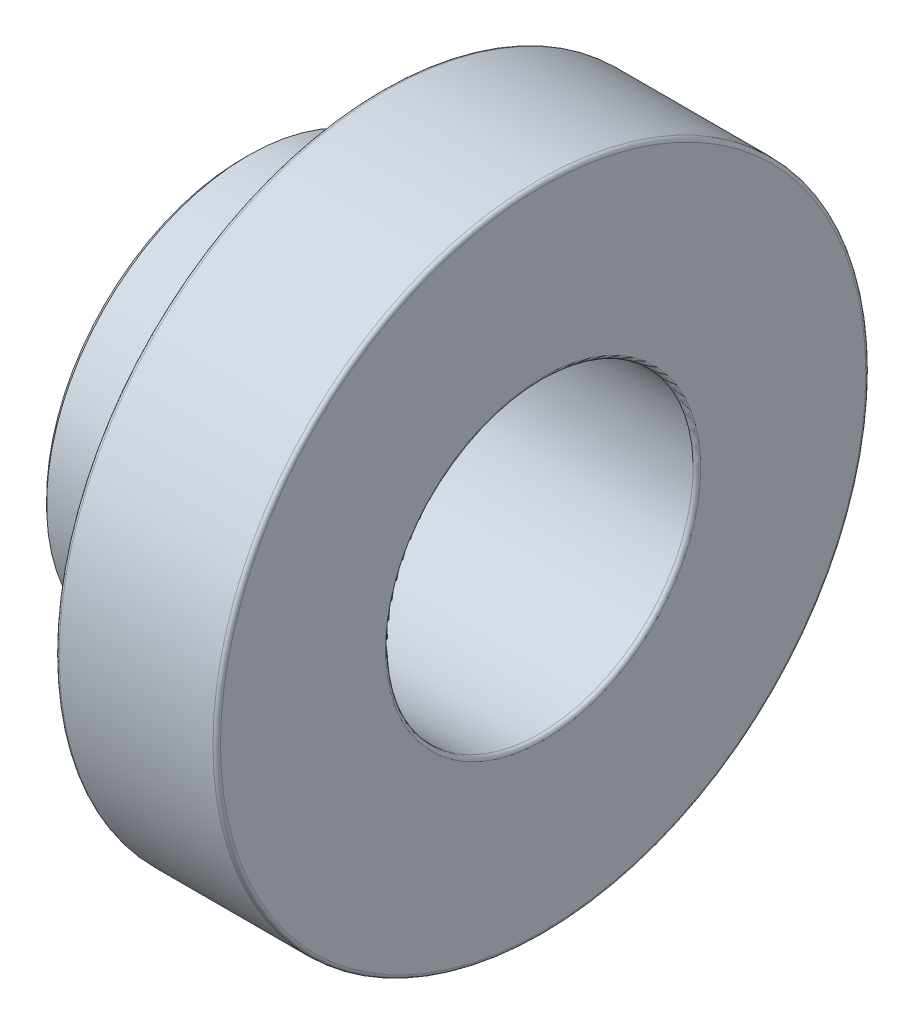
ISO-10303-21;
HEADER;
FILE_DESCRIPTION(('STEP AP214'),'2;1');
FILE_NAME('part.step','',(''),(''),'','','');
FILE_SCHEMA(('AUTOMOTIVE_DESIGN { 1 0 10303 214 1 1 1 1 }'));
ENDSEC;
DATA;
#1=APPLICATION_CONTEXT('core data for automotive mechanical design processes');
#2=APPLICATION_PROTOCOL_DEFINITION('international standard','automotive_design',2000,#1);
#3=PRODUCT_CONTEXT('',#1,'mechanical');
#4=PRODUCT('Part','Part','',(#3));
#5=PRODUCT_RELATED_PRODUCT_CATEGORY('part','',(#4));
#6=PRODUCT_DEFINITION_FORMATION('','',#4);
#7=PRODUCT_DEFINITION_CONTEXT('part definition',#1,'design');
#8=PRODUCT_DEFINITION('design','',#6,#7);
#9=PRODUCT_DEFINITION_SHAPE('','',#8);
#10=(LENGTH_UNIT() NAMED_UNIT(*) SI_UNIT(.MILLI.,.METRE.));
#11=(NAMED_UNIT(*) PLANE_ANGLE_UNIT() SI_UNIT($,.RADIAN.));
#12=(NAMED_UNIT(*) SI_UNIT($,.STERADIAN.) SOLID_ANGLE_UNIT());
#13=UNCERTAINTY_MEASURE_WITH_UNIT(LENGTH_MEASURE(1.E-05),#10,'distance_accuracy_value','');
#14=(GEOMETRIC_REPRESENTATION_CONTEXT(3) GLOBAL_UNCERTAINTY_ASSIGNED_CONTEXT((#13)) GLOBAL_UNIT_ASSIGNED_CONTEXT((#10,
#11,#12)) REPRESENTATION_CONTEXT('',''));
#15=CARTESIAN_POINT('',(0.,0.,0.));
#16=DIRECTION('',(0.,0.,1.));
#17=DIRECTION('',(1.,0.,0.));
#18=AXIS2_PLACEMENT_3D('',#15,#16,#17);
#19=CARTESIAN_POINT('',(6.4,6.1,0.));
#20=DIRECTION('',(1.,0.,0.));
#21=DIRECTION('',(0.,1.,0.));
#22=AXIS2_PLACEMENT_3D('',#19,#20,#21);
#23=PLANE('',#22);
#24=CARTESIAN_POINT('',(6.4,0.,0.));
#25=DIRECTION('',(1.,0.,0.));
#26=DIRECTION('',(0.,1.,0.));
#27=AXIS2_PLACEMENT_3D('',#24,#25,#26);
#28=CIRCLE('',#27,6.25);
#29=CARTESIAN_POINT('',(6.4,6.25,0.));
#30=VERTEX_POINT('',#29);
#31=EDGE_CURVE('E51',#30,#30,#28,.F.);
#32=ORIENTED_EDGE('',*,*,#31,.T.);
#33=EDGE_LOOP('',(#32));
#34=FACE_BOUND('',#33,.T.);
#35=CARTESIAN_POINT('',(6.4,0.,0.));
#36=DIRECTION('',(1.,0.,0.));
#37=DIRECTION('',(0.,1.,0.));
#38=AXIS2_PLACEMENT_3D('',#35,#36,#37);
#39=CIRCLE('',#38,12.8);
#40=CARTESIAN_POINT('',(6.4,12.8,0.));
#41=VERTEX_POINT('',#40);
#42=EDGE_CURVE('E66',#41,#41,#39,.T.);
#43=ORIENTED_EDGE('',*,*,#42,.T.);
#44=EDGE_LOOP('',(#43));
#45=FACE_BOUND('',#44,.T.);
#46=ADVANCED_FACE('F31',(#34,#45),#23,.T.);
#47=CARTESIAN_POINT('',(6.4,0.,0.));
#48=DIRECTION('',(1.,0.,0.));
#49=DIRECTION('',(0.,1.,0.));
#50=AXIS2_PLACEMENT_3D('',#47,#48,#49);
#51=CYLINDRICAL_SURFACE('',#50,12.95);
#52=CARTESIAN_POINT('',(6.25,0.,0.));
#53=DIRECTION('',(1.,0.,0.));
#54=DIRECTION('',(0.,1.,0.));
#55=AXIS2_PLACEMENT_3D('',#52,#53,#54);
#56=CIRCLE('',#55,12.95);
#57=CARTESIAN_POINT('',(6.25,12.95,0.));
#58=VERTEX_POINT('',#57);
#59=EDGE_CURVE('E60',#58,#58,#56,.F.);
#60=ORIENTED_EDGE('',*,*,#59,.T.);
#61=EDGE_LOOP('',(#60));
#62=FACE_BOUND('',#61,.T.);
#63=CARTESIAN_POINT('',(0.15,0.,0.));
#64=DIRECTION('',(-1.,0.,0.));
#65=DIRECTION('',(0.,-1.,0.));
#66=AXIS2_PLACEMENT_3D('',#63,#64,#65);
#67=CIRCLE('',#66,12.95);
#68=CARTESIAN_POINT('',(0.150000000000001,-12.95,0.));
#69=VERTEX_POINT('',#68);
#70=EDGE_CURVE('E63',#69,#69,#67,.F.);
#71=ORIENTED_EDGE('',*,*,#70,.T.);
#72=EDGE_LOOP('',(#71));
#73=FACE_BOUND('',#72,.T.);
#74=ADVANCED_FACE('F86',(#62,#73),#51,.T.);
#75=CARTESIAN_POINT('',(0.,12.95,0.));
#76=DIRECTION('',(-1.,0.,0.));
#77=DIRECTION('',(0.,-1.,0.));
#78=AXIS2_PLACEMENT_3D('',#75,#76,#77);
#79=PLANE('',#78);
#80=CARTESIAN_POINT('',(0.,0.,0.));
#81=DIRECTION('',(-1.,0.,0.));
#82=DIRECTION('',(0.,-1.,0.));
#83=AXIS2_PLACEMENT_3D('',#80,#81,#82);
#84=CIRCLE('',#83,12.8);
#85=CARTESIAN_POINT('',(0.,-12.8,0.));
#86=VERTEX_POINT('',#85);
#87=EDGE_CURVE('E57',#86,#86,#84,.T.);
#88=ORIENTED_EDGE('',*,*,#87,.T.);
#89=EDGE_LOOP('',(#88));
#90=FACE_BOUND('',#89,.T.);
#91=CARTESIAN_POINT('',(0.,0.,0.));
#92=DIRECTION('',(1.,0.,0.));
#93=DIRECTION('',(0.,1.,0.));
#94=AXIS2_PLACEMENT_3D('',#91,#92,#93);
#95=CIRCLE('',#94,8.);
#96=CARTESIAN_POINT('',(0.,8.,0.));
#97=VERTEX_POINT('',#96);
#98=EDGE_CURVE('E69',#97,#97,#95,.T.);
#99=ORIENTED_EDGE('',*,*,#98,.T.);
#100=EDGE_LOOP('',(#99));
#101=FACE_BOUND('',#100,.T.);
#102=ADVANCED_FACE('F73',(#90,#101),#79,.T.);
#103=CARTESIAN_POINT('',(6.4,0.,0.));
#104=DIRECTION('',(1.,0.,0.));
#105=DIRECTION('',(0.,1.,0.));
#106=AXIS2_PLACEMENT_3D('',#103,#104,#105);
#107=CYLINDRICAL_SURFACE('',#106,8.);
#108=CARTESIAN_POINT('',(-5.30000000000001,0.,0.));
#109=DIRECTION('',(-1.,0.,0.));
#110=DIRECTION('',(0.,-1.,0.));
#111=AXIS2_PLACEMENT_3D('',#108,#109,#110);
#112=CIRCLE('',#111,8.);
#113=CARTESIAN_POINT('',(-5.30000000000001,-8.,0.));
#114=VERTEX_POINT('',#113);
#115=EDGE_CURVE('E10',#114,#114,#112,.F.);
#116=ORIENTED_EDGE('',*,*,#115,.T.);
#117=EDGE_LOOP('',(#116));
#118=FACE_BOUND('',#117,.T.);
#119=ORIENTED_EDGE('',*,*,#98,.F.);
#120=EDGE_LOOP('',(#119));
#121=FACE_BOUND('',#120,.T.);
#122=ADVANCED_FACE('F75',(#118,#121),#107,.T.);
#123=CARTESIAN_POINT('',(-5.5,8.,0.));
#124=DIRECTION('',(-1.,0.,0.));
#125=DIRECTION('',(0.,-1.,0.));
#126=AXIS2_PLACEMENT_3D('',#123,#124,#125);
#127=PLANE('',#126);
#128=CARTESIAN_POINT('',(-5.5,0.,0.));
#129=DIRECTION('',(-1.,0.,0.));
#130=DIRECTION('',(0.,-1.,0.));
#131=AXIS2_PLACEMENT_3D('',#128,#129,#130);
#132=CIRCLE('',#131,6.3);
#133=CARTESIAN_POINT('',(-5.5,-6.3,0.));
#134=VERTEX_POINT('',#133);
#135=EDGE_CURVE('E42',#134,#134,#132,.F.);
#136=ORIENTED_EDGE('',*,*,#135,.T.);
#137=EDGE_LOOP('',(#136));
#138=FACE_BOUND('',#137,.T.);
#139=CARTESIAN_POINT('',(-5.5,0.,0.));
#140=DIRECTION('',(-1.,0.,0.));
#141=DIRECTION('',(0.,-1.,0.));
#142=AXIS2_PLACEMENT_3D('',#139,#140,#141);
#143=CIRCLE('',#142,7.80000000000001);
#144=CARTESIAN_POINT('',(-5.5,-7.80000000000001,0.));
#145=VERTEX_POINT('',#144);
#146=EDGE_CURVE('E46',#145,#145,#143,.T.);
#147=ORIENTED_EDGE('',*,*,#146,.T.);
#148=EDGE_LOOP('',(#147));
#149=FACE_BOUND('',#148,.T.);
#150=ADVANCED_FACE('F77',(#138,#149),#127,.T.);
#151=CARTESIAN_POINT('',(6.4,0.,0.));
#152=DIRECTION('',(1.,0.,0.));
#153=DIRECTION('',(0.,1.,0.));
#154=AXIS2_PLACEMENT_3D('',#151,#152,#153);
#155=CYLINDRICAL_SURFACE('',#154,6.1);
#156=CARTESIAN_POINT('',(-5.29999999999999,0.,0.));
#157=DIRECTION('',(-1.,0.,0.));
#158=DIRECTION('',(0.,-1.,0.));
#159=AXIS2_PLACEMENT_3D('',#156,#157,#158);
#160=CIRCLE('',#159,6.1);
#161=CARTESIAN_POINT('',(-5.29999999999999,-6.1,0.));
#162=VERTEX_POINT('',#161);
#163=EDGE_CURVE('E38',#162,#162,#160,.T.);
#164=ORIENTED_EDGE('',*,*,#163,.T.);
#165=EDGE_LOOP('',(#164));
#166=FACE_BOUND('',#165,.T.);
#167=CARTESIAN_POINT('',(6.25,0.,0.));
#168=DIRECTION('',(1.,0.,0.));
#169=DIRECTION('',(0.,1.,0.));
#170=AXIS2_PLACEMENT_3D('',#167,#168,#169);
#171=CIRCLE('',#170,6.1);
#172=CARTESIAN_POINT('',(6.25,6.1,0.));
#173=VERTEX_POINT('',#172);
#174=EDGE_CURVE('E54',#173,#173,#171,.T.);
#175=ORIENTED_EDGE('',*,*,#174,.T.);
#176=EDGE_LOOP('',(#175));
#177=FACE_BOUND('',#176,.T.);
#178=ADVANCED_FACE('F83',(#166,#177),#155,.F.);
#179=CARTESIAN_POINT('',(6.25,0.,0.));
#180=DIRECTION('',(1.,0.,0.));
#181=DIRECTION('',(0.,1.,0.));
#182=AXIS2_PLACEMENT_3D('',#179,#180,#181);
#183=TOROIDAL_SURFACE('',#182,12.8,0.15);
#184=ORIENTED_EDGE('',*,*,#59,.F.);
#185=EDGE_LOOP('',(#184));
#186=FACE_BOUND('',#185,.T.);
#187=ORIENTED_EDGE('',*,*,#42,.F.);
#188=EDGE_LOOP('',(#187));
#189=FACE_BOUND('',#188,.T.);
#190=ADVANCED_FACE('F99',(#186,#189),#183,.T.);
#191=CARTESIAN_POINT('',(0.15,0.,0.));
#192=DIRECTION('',(-1.,0.,0.));
#193=DIRECTION('',(0.,-1.,0.));
#194=AXIS2_PLACEMENT_3D('',#191,#192,#193);
#195=TOROIDAL_SURFACE('',#194,12.8,0.15);
#196=ORIENTED_EDGE('',*,*,#87,.F.);
#197=EDGE_LOOP('',(#196));
#198=FACE_BOUND('',#197,.T.);
#199=ORIENTED_EDGE('',*,*,#70,.F.);
#200=EDGE_LOOP('',(#199));
#201=FACE_BOUND('',#200,.T.);
#202=ADVANCED_FACE('F102',(#198,#201),#195,.T.);
#203=CARTESIAN_POINT('',(6.25,0.,0.));
#204=DIRECTION('',(1.,0.,0.));
#205=DIRECTION('',(0.,1.,0.));
#206=AXIS2_PLACEMENT_3D('',#203,#204,#205);
#207=TOROIDAL_SURFACE('',#206,6.25,0.15);
#208=ORIENTED_EDGE('',*,*,#31,.F.);
#209=EDGE_LOOP('',(#208));
#210=FACE_BOUND('',#209,.T.);
#211=ORIENTED_EDGE('',*,*,#174,.F.);
#212=EDGE_LOOP('',(#211));
#213=FACE_BOUND('',#212,.T.);
#214=ADVANCED_FACE('F106',(#210,#213),#207,.T.);
#215=CARTESIAN_POINT('',(-5.5,0.,0.));
#216=DIRECTION('',(-1.,0.,0.));
#217=DIRECTION('',(0.,-1.,0.));
#218=AXIS2_PLACEMENT_3D('',#215,#216,#217);
#219=CONICAL_SURFACE('',#218,6.3,0.785398163397442);
#220=ORIENTED_EDGE('',*,*,#163,.F.);
#221=EDGE_LOOP('',(#220));
#222=FACE_BOUND('',#221,.T.);
#223=ORIENTED_EDGE('',*,*,#135,.F.);
#224=EDGE_LOOP('',(#223));
#225=FACE_BOUND('',#224,.T.);
#226=ADVANCED_FACE('F109',(#222,#225),#219,.F.);
#227=CARTESIAN_POINT('',(-5.30000000000001,0.,0.));
#228=DIRECTION('',(1.,0.,0.));
#229=DIRECTION('',(0.,1.,0.));
#230=AXIS2_PLACEMENT_3D('',#227,#228,#229);
#231=CONICAL_SURFACE('',#230,8.,0.785398163397455);
#232=ORIENTED_EDGE('',*,*,#146,.F.);
#233=EDGE_LOOP('',(#232));
#234=FACE_BOUND('',#233,.T.);
#235=ORIENTED_EDGE('',*,*,#115,.F.);
#236=EDGE_LOOP('',(#235));
#237=FACE_BOUND('',#236,.T.);
#238=ADVANCED_FACE('F33',(#234,#237),#231,.T.);
#239=CLOSED_SHELL('',(#46,#74,#102,#122,#150,#178,#190,#202,#214,#226,#238));
#240=MANIFOLD_SOLID_BREP('B2',#239);
#241=ADVANCED_BREP_SHAPE_REPRESENTATION('',(#18,#240),#14);
#242=SHAPE_DEFINITION_REPRESENTATION(#9,#241);
ENDSEC;
END-ISO-10303-21;
